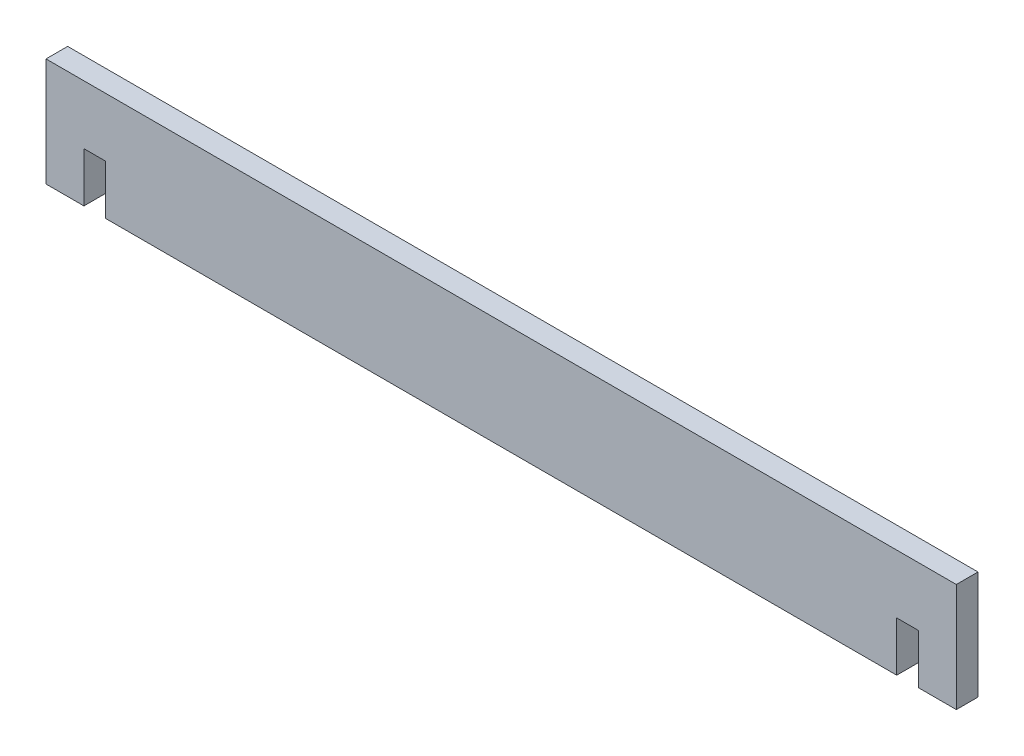
ISO-10303-21;
HEADER;
FILE_DESCRIPTION(('STEP AP214'),'2;1');
FILE_NAME('part.step','',(''),(''),'','','');
FILE_SCHEMA(('AUTOMOTIVE_DESIGN { 1 0 10303 214 1 1 1 1 }'));
ENDSEC;
DATA;
#1=APPLICATION_CONTEXT('core data for automotive mechanical design processes');
#2=APPLICATION_PROTOCOL_DEFINITION('international standard','automotive_design',2000,#1);
#3=PRODUCT_CONTEXT('',#1,'mechanical');
#4=PRODUCT('Part','Part','',(#3));
#5=PRODUCT_RELATED_PRODUCT_CATEGORY('part','',(#4));
#6=PRODUCT_DEFINITION_FORMATION('','',#4);
#7=PRODUCT_DEFINITION_CONTEXT('part definition',#1,'design');
#8=PRODUCT_DEFINITION('design','',#6,#7);
#9=PRODUCT_DEFINITION_SHAPE('','',#8);
#10=(LENGTH_UNIT() NAMED_UNIT(*) SI_UNIT(.MILLI.,.METRE.));
#11=(NAMED_UNIT(*) PLANE_ANGLE_UNIT() SI_UNIT($,.RADIAN.));
#12=(NAMED_UNIT(*) SI_UNIT($,.STERADIAN.) SOLID_ANGLE_UNIT());
#13=UNCERTAINTY_MEASURE_WITH_UNIT(LENGTH_MEASURE(1.E-05),#10,'distance_accuracy_value','');
#14=(GEOMETRIC_REPRESENTATION_CONTEXT(3) GLOBAL_UNCERTAINTY_ASSIGNED_CONTEXT((#13)) GLOBAL_UNIT_ASSIGNED_CONTEXT((#10,
#11,#12)) REPRESENTATION_CONTEXT('',''));
#15=CARTESIAN_POINT('',(0.,0.,0.));
#16=DIRECTION('',(0.,0.,1.));
#17=DIRECTION('',(1.,0.,0.));
#18=AXIS2_PLACEMENT_3D('',#15,#16,#17);
#19=CARTESIAN_POINT('',(-210.,27.1106898526916,10.));
#20=DIRECTION('',(1.,0.,0.));
#21=DIRECTION('',(0.,0.,-1.));
#22=AXIS2_PLACEMENT_3D('',#19,#20,#21);
#23=PLANE('',#22);
#24=DIRECTION('',(0.,-1.,0.));
#25=VECTOR('',#24,1.);
#26=CARTESIAN_POINT('',(-210.,27.1106898526916,0.));
#27=LINE('',#26,#25);
#28=CARTESIAN_POINT('',(-210.,27.1106898526916,0.));
#29=VERTEX_POINT('',#28);
#30=CARTESIAN_POINT('',(-210.,-22.8893101473084,0.));
#31=VERTEX_POINT('',#30);
#32=EDGE_CURVE('E166',#29,#31,#27,.T.);
#33=ORIENTED_EDGE('',*,*,#32,.T.);
#34=DIRECTION('',(0.,0.,-1.));
#35=VECTOR('',#34,1.);
#36=CARTESIAN_POINT('',(-210.,-22.8893101473084,10.));
#37=LINE('',#36,#35);
#38=CARTESIAN_POINT('',(-210.,-22.8893101473084,10.));
#39=VERTEX_POINT('',#38);
#40=EDGE_CURVE('E11',#39,#31,#37,.T.);
#41=ORIENTED_EDGE('',*,*,#40,.F.);
#42=DIRECTION('',(0.,-1.,0.));
#43=VECTOR('',#42,1.);
#44=CARTESIAN_POINT('',(-210.,27.1106898526916,10.));
#45=LINE('',#44,#43);
#46=CARTESIAN_POINT('',(-210.,27.1106898526916,10.));
#47=VERTEX_POINT('',#46);
#48=EDGE_CURVE('E200',#47,#39,#45,.T.);
#49=ORIENTED_EDGE('',*,*,#48,.F.);
#50=DIRECTION('',(0.,0.,-1.));
#51=VECTOR('',#50,1.);
#52=CARTESIAN_POINT('',(-210.,27.1106898526916,10.));
#53=LINE('',#52,#51);
#54=EDGE_CURVE('E162',#47,#29,#53,.T.);
#55=ORIENTED_EDGE('',*,*,#54,.T.);
#56=EDGE_LOOP('',(#33,#41,#49,#55));
#57=FACE_BOUND('',#56,.T.);
#58=ADVANCED_FACE('F41',(#57),#23,.F.);
#59=CARTESIAN_POINT('',(-210.,-22.8893101473084,10.));
#60=DIRECTION('',(0.,1.,0.));
#61=DIRECTION('',(-1.,0.,0.));
#62=AXIS2_PLACEMENT_3D('',#59,#60,#61);
#63=PLANE('',#62);
#64=DIRECTION('',(1.,0.,0.));
#65=VECTOR('',#64,1.);
#66=CARTESIAN_POINT('',(-210.,-22.8893101473084,0.));
#67=LINE('',#66,#65);
#68=CARTESIAN_POINT('',(-192.5,-22.8893101473084,0.));
#69=VERTEX_POINT('',#68);
#70=EDGE_CURVE('E170',#31,#69,#67,.T.);
#71=ORIENTED_EDGE('',*,*,#70,.T.);
#72=DIRECTION('',(0.,0.,-1.));
#73=VECTOR('',#72,1.);
#74=CARTESIAN_POINT('',(-192.5,-22.8893101473084,10.));
#75=LINE('',#74,#73);
#76=CARTESIAN_POINT('',(-192.5,-22.8893101473084,10.));
#77=VERTEX_POINT('',#76);
#78=EDGE_CURVE('E50',#77,#69,#75,.T.);
#79=ORIENTED_EDGE('',*,*,#78,.F.);
#80=DIRECTION('',(1.,0.,0.));
#81=VECTOR('',#80,1.);
#82=CARTESIAN_POINT('',(-210.,-22.8893101473084,10.));
#83=LINE('',#82,#81);
#84=EDGE_CURVE('E113',#39,#77,#83,.T.);
#85=ORIENTED_EDGE('',*,*,#84,.F.);
#86=ORIENTED_EDGE('',*,*,#40,.T.);
#87=EDGE_LOOP('',(#71,#79,#85,#86));
#88=FACE_BOUND('',#87,.T.);
#89=ADVANCED_FACE('F294',(#88),#63,.F.);
#90=CARTESIAN_POINT('',(-192.5,-22.8893101473084,10.));
#91=DIRECTION('',(-1.,0.,0.));
#92=DIRECTION('',(0.,0.,1.));
#93=AXIS2_PLACEMENT_3D('',#90,#91,#92);
#94=PLANE('',#93);
#95=DIRECTION('',(0.,1.,0.));
#96=VECTOR('',#95,1.);
#97=CARTESIAN_POINT('',(-192.5,-22.8893101473084,0.));
#98=LINE('',#97,#96);
#99=CARTESIAN_POINT('',(-192.5,0.,0.));
#100=VERTEX_POINT('',#99);
#101=EDGE_CURVE('E173',#69,#100,#98,.T.);
#102=ORIENTED_EDGE('',*,*,#101,.T.);
#103=DIRECTION('',(0.,0.,-1.));
#104=VECTOR('',#103,1.);
#105=CARTESIAN_POINT('',(-192.5,0.,10.));
#106=LINE('',#105,#104);
#107=CARTESIAN_POINT('',(-192.5,0.,10.));
#108=VERTEX_POINT('',#107);
#109=EDGE_CURVE('E227',#108,#100,#106,.T.);
#110=ORIENTED_EDGE('',*,*,#109,.F.);
#111=DIRECTION('',(0.,1.,0.));
#112=VECTOR('',#111,1.);
#113=CARTESIAN_POINT('',(-192.5,-22.8893101473084,10.));
#114=LINE('',#113,#112);
#115=EDGE_CURVE('E237',#77,#108,#114,.T.);
#116=ORIENTED_EDGE('',*,*,#115,.F.);
#117=ORIENTED_EDGE('',*,*,#78,.T.);
#118=EDGE_LOOP('',(#102,#110,#116,#117));
#119=FACE_BOUND('',#118,.T.);
#120=ADVANCED_FACE('F235',(#119),#94,.F.);
#121=CARTESIAN_POINT('',(-192.5,0.,10.));
#122=DIRECTION('',(0.,1.,0.));
#123=DIRECTION('',(0.,0.,1.));
#124=AXIS2_PLACEMENT_3D('',#121,#122,#123);
#125=PLANE('',#124);
#126=DIRECTION('',(1.,0.,0.));
#127=VECTOR('',#126,1.);
#128=CARTESIAN_POINT('',(-192.5,0.,0.));
#129=LINE('',#128,#127);
#130=CARTESIAN_POINT('',(-182.5,0.,0.));
#131=VERTEX_POINT('',#130);
#132=EDGE_CURVE('E176',#100,#131,#129,.T.);
#133=ORIENTED_EDGE('',*,*,#132,.T.);
#134=DIRECTION('',(0.,0.,-1.));
#135=VECTOR('',#134,1.);
#136=CARTESIAN_POINT('',(-182.5,0.,10.));
#137=LINE('',#136,#135);
#138=CARTESIAN_POINT('',(-182.5,0.,10.));
#139=VERTEX_POINT('',#138);
#140=EDGE_CURVE('E223',#139,#131,#137,.T.);
#141=ORIENTED_EDGE('',*,*,#140,.F.);
#142=DIRECTION('',(1.,0.,0.));
#143=VECTOR('',#142,1.);
#144=CARTESIAN_POINT('',(-192.5,0.,10.));
#145=LINE('',#144,#143);
#146=EDGE_CURVE('E256',#108,#139,#145,.T.);
#147=ORIENTED_EDGE('',*,*,#146,.F.);
#148=ORIENTED_EDGE('',*,*,#109,.T.);
#149=EDGE_LOOP('',(#133,#141,#147,#148));
#150=FACE_BOUND('',#149,.T.);
#151=ADVANCED_FACE('F246',(#150),#125,.F.);
#152=CARTESIAN_POINT('',(-182.5,0.,10.));
#153=DIRECTION('',(1.,0.,0.));
#154=DIRECTION('',(0.,0.,-1.));
#155=AXIS2_PLACEMENT_3D('',#152,#153,#154);
#156=PLANE('',#155);
#157=DIRECTION('',(0.,-1.,0.));
#158=VECTOR('',#157,1.);
#159=CARTESIAN_POINT('',(-182.5,0.,0.));
#160=LINE('',#159,#158);
#161=CARTESIAN_POINT('',(-182.5,-22.8893101473084,0.));
#162=VERTEX_POINT('',#161);
#163=EDGE_CURVE('E179',#131,#162,#160,.T.);
#164=ORIENTED_EDGE('',*,*,#163,.T.);
#165=DIRECTION('',(0.,0.,-1.));
#166=VECTOR('',#165,1.);
#167=CARTESIAN_POINT('',(-182.5,-22.8893101473084,10.));
#168=LINE('',#167,#166);
#169=CARTESIAN_POINT('',(-182.5,-22.8893101473084,10.));
#170=VERTEX_POINT('',#169);
#171=EDGE_CURVE('E219',#170,#162,#168,.T.);
#172=ORIENTED_EDGE('',*,*,#171,.F.);
#173=DIRECTION('',(0.,-1.,0.));
#174=VECTOR('',#173,1.);
#175=CARTESIAN_POINT('',(-182.5,0.,10.));
#176=LINE('',#175,#174);
#177=EDGE_CURVE('E252',#139,#170,#176,.T.);
#178=ORIENTED_EDGE('',*,*,#177,.F.);
#179=ORIENTED_EDGE('',*,*,#140,.T.);
#180=EDGE_LOOP('',(#164,#172,#178,#179));
#181=FACE_BOUND('',#180,.T.);
#182=ADVANCED_FACE('F250',(#181),#156,.F.);
#183=CARTESIAN_POINT('',(-182.5,-22.8893101473084,10.));
#184=DIRECTION('',(0.,1.,0.));
#185=DIRECTION('',(0.,0.,1.));
#186=AXIS2_PLACEMENT_3D('',#183,#184,#185);
#187=PLANE('',#186);
#188=DIRECTION('',(1.,0.,0.));
#189=VECTOR('',#188,1.);
#190=CARTESIAN_POINT('',(-182.5,-22.8893101473084,0.));
#191=LINE('',#190,#189);
#192=CARTESIAN_POINT('',(182.5,-22.8893101473084,0.));
#193=VERTEX_POINT('',#192);
#194=EDGE_CURVE('E182',#162,#193,#191,.T.);
#195=ORIENTED_EDGE('',*,*,#194,.T.);
#196=DIRECTION('',(0.,0.,-1.));
#197=VECTOR('',#196,1.);
#198=CARTESIAN_POINT('',(182.5,-22.8893101473084,10.));
#199=LINE('',#198,#197);
#200=CARTESIAN_POINT('',(182.5,-22.8893101473084,10.));
#201=VERTEX_POINT('',#200);
#202=EDGE_CURVE('E215',#201,#193,#199,.T.);
#203=ORIENTED_EDGE('',*,*,#202,.F.);
#204=DIRECTION('',(1.,0.,0.));
#205=VECTOR('',#204,1.);
#206=CARTESIAN_POINT('',(-182.5,-22.8893101473084,10.));
#207=LINE('',#206,#205);
#208=EDGE_CURVE('E255',#170,#201,#207,.T.);
#209=ORIENTED_EDGE('',*,*,#208,.F.);
#210=ORIENTED_EDGE('',*,*,#171,.T.);
#211=EDGE_LOOP('',(#195,#203,#209,#210));
#212=FACE_BOUND('',#211,.T.);
#213=ADVANCED_FACE('F307',(#212),#187,.F.);
#214=CARTESIAN_POINT('',(182.5,-22.8893101473084,10.));
#215=DIRECTION('',(-1.,0.,0.));
#216=DIRECTION('',(0.,0.,1.));
#217=AXIS2_PLACEMENT_3D('',#214,#215,#216);
#218=PLANE('',#217);
#219=DIRECTION('',(0.,1.,0.));
#220=VECTOR('',#219,1.);
#221=CARTESIAN_POINT('',(182.5,-22.8893101473084,0.));
#222=LINE('',#221,#220);
#223=CARTESIAN_POINT('',(182.5,0.,0.));
#224=VERTEX_POINT('',#223);
#225=EDGE_CURVE('E185',#193,#224,#222,.T.);
#226=ORIENTED_EDGE('',*,*,#225,.T.);
#227=DIRECTION('',(0.,0.,-1.));
#228=VECTOR('',#227,1.);
#229=CARTESIAN_POINT('',(182.5,0.,10.));
#230=LINE('',#229,#228);
#231=CARTESIAN_POINT('',(182.5,0.,10.));
#232=VERTEX_POINT('',#231);
#233=EDGE_CURVE('E211',#232,#224,#230,.T.);
#234=ORIENTED_EDGE('',*,*,#233,.F.);
#235=DIRECTION('',(0.,1.,0.));
#236=VECTOR('',#235,1.);
#237=CARTESIAN_POINT('',(182.5,-22.8893101473084,10.));
#238=LINE('',#237,#236);
#239=EDGE_CURVE('E260',#201,#232,#238,.T.);
#240=ORIENTED_EDGE('',*,*,#239,.F.);
#241=ORIENTED_EDGE('',*,*,#202,.T.);
#242=EDGE_LOOP('',(#226,#234,#240,#241));
#243=FACE_BOUND('',#242,.T.);
#244=ADVANCED_FACE('F310',(#243),#218,.F.);
#245=CARTESIAN_POINT('',(182.5,0.,10.));
#246=DIRECTION('',(0.,1.,0.));
#247=DIRECTION('',(0.,0.,1.));
#248=AXIS2_PLACEMENT_3D('',#245,#246,#247);
#249=PLANE('',#248);
#250=DIRECTION('',(1.,0.,0.));
#251=VECTOR('',#250,1.);
#252=CARTESIAN_POINT('',(182.5,0.,0.));
#253=LINE('',#252,#251);
#254=CARTESIAN_POINT('',(192.5,0.,0.));
#255=VERTEX_POINT('',#254);
#256=EDGE_CURVE('E188',#224,#255,#253,.T.);
#257=ORIENTED_EDGE('',*,*,#256,.T.);
#258=DIRECTION('',(0.,0.,-1.));
#259=VECTOR('',#258,1.);
#260=CARTESIAN_POINT('',(192.5,0.,10.));
#261=LINE('',#260,#259);
#262=CARTESIAN_POINT('',(192.5,0.,10.));
#263=VERTEX_POINT('',#262);
#264=EDGE_CURVE('E207',#263,#255,#261,.T.);
#265=ORIENTED_EDGE('',*,*,#264,.F.);
#266=DIRECTION('',(1.,0.,0.));
#267=VECTOR('',#266,1.);
#268=CARTESIAN_POINT('',(182.5,0.,10.));
#269=LINE('',#268,#267);
#270=EDGE_CURVE('E267',#232,#263,#269,.T.);
#271=ORIENTED_EDGE('',*,*,#270,.F.);
#272=ORIENTED_EDGE('',*,*,#233,.T.);
#273=EDGE_LOOP('',(#257,#265,#271,#272));
#274=FACE_BOUND('',#273,.T.);
#275=ADVANCED_FACE('F275',(#274),#249,.F.);
#276=CARTESIAN_POINT('',(192.5,0.,10.));
#277=DIRECTION('',(1.,0.,0.));
#278=DIRECTION('',(0.,0.,-1.));
#279=AXIS2_PLACEMENT_3D('',#276,#277,#278);
#280=PLANE('',#279);
#281=DIRECTION('',(0.,-1.,0.));
#282=VECTOR('',#281,1.);
#283=CARTESIAN_POINT('',(192.5,0.,0.));
#284=LINE('',#283,#282);
#285=CARTESIAN_POINT('',(192.5,-22.8893101473084,0.));
#286=VERTEX_POINT('',#285);
#287=EDGE_CURVE('E191',#255,#286,#284,.T.);
#288=ORIENTED_EDGE('',*,*,#287,.T.);
#289=DIRECTION('',(0.,0.,-1.));
#290=VECTOR('',#289,1.);
#291=CARTESIAN_POINT('',(192.5,-22.8893101473084,10.));
#292=LINE('',#291,#290);
#293=CARTESIAN_POINT('',(192.5,-22.8893101473084,10.));
#294=VERTEX_POINT('',#293);
#295=EDGE_CURVE('E155',#294,#286,#292,.T.);
#296=ORIENTED_EDGE('',*,*,#295,.F.);
#297=DIRECTION('',(0.,-1.,0.));
#298=VECTOR('',#297,1.);
#299=CARTESIAN_POINT('',(192.5,0.,10.));
#300=LINE('',#299,#298);
#301=EDGE_CURVE('E144',#263,#294,#300,.T.);
#302=ORIENTED_EDGE('',*,*,#301,.F.);
#303=ORIENTED_EDGE('',*,*,#264,.T.);
#304=EDGE_LOOP('',(#288,#296,#302,#303));
#305=FACE_BOUND('',#304,.T.);
#306=ADVANCED_FACE('F279',(#305),#280,.F.);
#307=CARTESIAN_POINT('',(192.5,-22.8893101473084,10.));
#308=DIRECTION('',(0.,1.,0.));
#309=DIRECTION('',(0.,0.,1.));
#310=AXIS2_PLACEMENT_3D('',#307,#308,#309);
#311=PLANE('',#310);
#312=DIRECTION('',(1.,0.,0.));
#313=VECTOR('',#312,1.);
#314=CARTESIAN_POINT('',(192.5,-22.8893101473084,0.));
#315=LINE('',#314,#313);
#316=CARTESIAN_POINT('',(210.,-22.8893101473084,0.));
#317=VERTEX_POINT('',#316);
#318=EDGE_CURVE('E153',#286,#317,#315,.T.);
#319=ORIENTED_EDGE('',*,*,#318,.T.);
#320=DIRECTION('',(0.,0.,-1.));
#321=VECTOR('',#320,1.);
#322=CARTESIAN_POINT('',(210.,-22.8893101473084,10.));
#323=LINE('',#322,#321);
#324=CARTESIAN_POINT('',(210.,-22.8893101473084,10.));
#325=VERTEX_POINT('',#324);
#326=EDGE_CURVE('E150',#325,#317,#323,.T.);
#327=ORIENTED_EDGE('',*,*,#326,.F.);
#328=DIRECTION('',(1.,0.,0.));
#329=VECTOR('',#328,1.);
#330=CARTESIAN_POINT('',(192.5,-22.8893101473084,10.));
#331=LINE('',#330,#329);
#332=EDGE_CURVE('E138',#294,#325,#331,.T.);
#333=ORIENTED_EDGE('',*,*,#332,.F.);
#334=ORIENTED_EDGE('',*,*,#295,.T.);
#335=EDGE_LOOP('',(#319,#327,#333,#334));
#336=FACE_BOUND('',#335,.T.);
#337=ADVANCED_FACE('F151',(#336),#311,.F.);
#338=CARTESIAN_POINT('',(210.,27.1106898526916,10.));
#339=DIRECTION('',(-1.,0.,0.));
#340=DIRECTION('',(0.,0.,1.));
#341=AXIS2_PLACEMENT_3D('',#338,#339,#340);
#342=PLANE('',#341);
#343=DIRECTION('',(0.,1.,0.));
#344=VECTOR('',#343,1.);
#345=CARTESIAN_POINT('',(210.,27.1106898526916,0.));
#346=LINE('',#345,#344);
#347=CARTESIAN_POINT('',(210.,27.1106898526916,0.));
#348=VERTEX_POINT('',#347);
#349=EDGE_CURVE('E99',#317,#348,#346,.T.);
#350=ORIENTED_EDGE('',*,*,#349,.T.);
#351=DIRECTION('',(0.,0.,-1.));
#352=VECTOR('',#351,1.);
#353=CARTESIAN_POINT('',(210.,27.1106898526916,10.));
#354=LINE('',#353,#352);
#355=CARTESIAN_POINT('',(210.,27.1106898526916,10.));
#356=VERTEX_POINT('',#355);
#357=EDGE_CURVE('E156',#356,#348,#354,.T.);
#358=ORIENTED_EDGE('',*,*,#357,.F.);
#359=DIRECTION('',(0.,1.,0.));
#360=VECTOR('',#359,1.);
#361=CARTESIAN_POINT('',(210.,27.1106898526916,10.));
#362=LINE('',#361,#360);
#363=EDGE_CURVE('E142',#325,#356,#362,.T.);
#364=ORIENTED_EDGE('',*,*,#363,.F.);
#365=ORIENTED_EDGE('',*,*,#326,.T.);
#366=EDGE_LOOP('',(#350,#358,#364,#365));
#367=FACE_BOUND('',#366,.T.);
#368=ADVANCED_FACE('F158',(#367),#342,.F.);
#369=CARTESIAN_POINT('',(-210.,27.1106898526916,10.));
#370=DIRECTION('',(0.,-1.,0.));
#371=DIRECTION('',(0.,0.,-1.));
#372=AXIS2_PLACEMENT_3D('',#369,#370,#371);
#373=PLANE('',#372);
#374=DIRECTION('',(-1.,0.,0.));
#375=VECTOR('',#374,1.);
#376=CARTESIAN_POINT('',(-210.,27.1106898526916,0.));
#377=LINE('',#376,#375);
#378=EDGE_CURVE('E105',#348,#29,#377,.T.);
#379=ORIENTED_EDGE('',*,*,#378,.T.);
#380=ORIENTED_EDGE('',*,*,#54,.F.);
#381=DIRECTION('',(-1.,0.,0.));
#382=VECTOR('',#381,1.);
#383=CARTESIAN_POINT('',(-210.,27.1106898526916,10.));
#384=LINE('',#383,#382);
#385=EDGE_CURVE('E58',#356,#47,#384,.T.);
#386=ORIENTED_EDGE('',*,*,#385,.F.);
#387=ORIENTED_EDGE('',*,*,#357,.T.);
#388=EDGE_LOOP('',(#379,#380,#386,#387));
#389=FACE_BOUND('',#388,.T.);
#390=ADVANCED_FACE('F283',(#389),#373,.F.);
#391=CARTESIAN_POINT('',(0.,0.,10.));
#392=DIRECTION('',(0.,0.,1.));
#393=DIRECTION('',(1.,0.,0.));
#394=AXIS2_PLACEMENT_3D('',#391,#392,#393);
#395=PLANE('',#394);
#396=ORIENTED_EDGE('',*,*,#48,.T.);
#397=ORIENTED_EDGE('',*,*,#84,.T.);
#398=ORIENTED_EDGE('',*,*,#115,.T.);
#399=ORIENTED_EDGE('',*,*,#146,.T.);
#400=ORIENTED_EDGE('',*,*,#177,.T.);
#401=ORIENTED_EDGE('',*,*,#208,.T.);
#402=ORIENTED_EDGE('',*,*,#239,.T.);
#403=ORIENTED_EDGE('',*,*,#270,.T.);
#404=ORIENTED_EDGE('',*,*,#301,.T.);
#405=ORIENTED_EDGE('',*,*,#332,.T.);
#406=ORIENTED_EDGE('',*,*,#363,.T.);
#407=ORIENTED_EDGE('',*,*,#385,.T.);
#408=EDGE_LOOP('',(#396,#397,#398,#399,#400,#401,#402,#403,#404,#405,#406,#407));
#409=FACE_BOUND('',#408,.T.);
#410=ADVANCED_FACE('F140',(#409),#395,.T.);
#411=CARTESIAN_POINT('',(0.,0.,0.));
#412=DIRECTION('',(0.,0.,1.));
#413=DIRECTION('',(1.,0.,0.));
#414=AXIS2_PLACEMENT_3D('',#411,#412,#413);
#415=PLANE('',#414);
#416=ORIENTED_EDGE('',*,*,#32,.F.);
#417=ORIENTED_EDGE('',*,*,#378,.F.);
#418=ORIENTED_EDGE('',*,*,#349,.F.);
#419=ORIENTED_EDGE('',*,*,#318,.F.);
#420=ORIENTED_EDGE('',*,*,#287,.F.);
#421=ORIENTED_EDGE('',*,*,#256,.F.);
#422=ORIENTED_EDGE('',*,*,#225,.F.);
#423=ORIENTED_EDGE('',*,*,#194,.F.);
#424=ORIENTED_EDGE('',*,*,#163,.F.);
#425=ORIENTED_EDGE('',*,*,#132,.F.);
#426=ORIENTED_EDGE('',*,*,#101,.F.);
#427=ORIENTED_EDGE('',*,*,#70,.F.);
#428=EDGE_LOOP('',(#416,#417,#418,#419,#420,#421,#422,#423,#424,#425,#426,#427));
#429=FACE_BOUND('',#428,.T.);
#430=ADVANCED_FACE('F241',(#429),#415,.F.);
#431=CLOSED_SHELL('',(#58,#89,#120,#151,#182,#213,#244,#275,#306,#337,#368,#390,#410,#430));
#432=MANIFOLD_SOLID_BREP('B2',#431);
#433=ADVANCED_BREP_SHAPE_REPRESENTATION('',(#18,#432),#14);
#434=SHAPE_DEFINITION_REPRESENTATION(#9,#433);
ENDSEC;
END-ISO-10303-21;
